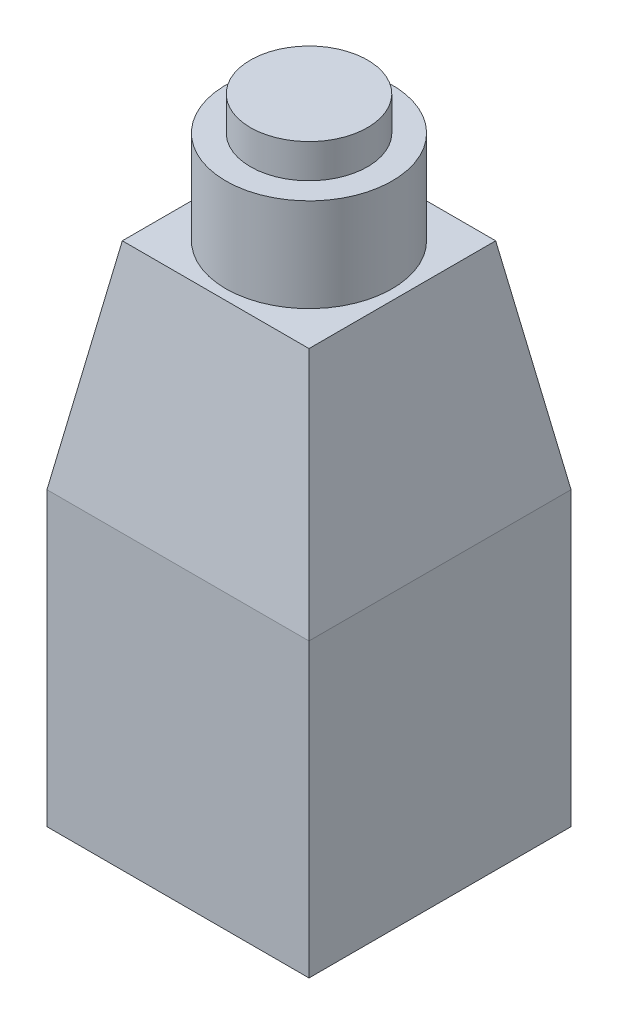
ISO-10303-21;
HEADER;
FILE_DESCRIPTION(('STEP AP214'),'2;1');
FILE_NAME('part.step','',(''),(''),'','','');
FILE_SCHEMA(('AUTOMOTIVE_DESIGN { 1 0 10303 214 1 1 1 1 }'));
ENDSEC;
DATA;
#1=APPLICATION_CONTEXT('core data for automotive mechanical design processes');
#2=APPLICATION_PROTOCOL_DEFINITION('international standard','automotive_design',2000,#1);
#3=PRODUCT_CONTEXT('',#1,'mechanical');
#4=PRODUCT('Part','Part','',(#3));
#5=PRODUCT_RELATED_PRODUCT_CATEGORY('part','',(#4));
#6=PRODUCT_DEFINITION_FORMATION('','',#4);
#7=PRODUCT_DEFINITION_CONTEXT('part definition',#1,'design');
#8=PRODUCT_DEFINITION('design','',#6,#7);
#9=PRODUCT_DEFINITION_SHAPE('','',#8);
#10=(LENGTH_UNIT() NAMED_UNIT(*) SI_UNIT(.MILLI.,.METRE.));
#11=(NAMED_UNIT(*) PLANE_ANGLE_UNIT() SI_UNIT($,.RADIAN.));
#12=(NAMED_UNIT(*) SI_UNIT($,.STERADIAN.) SOLID_ANGLE_UNIT());
#13=UNCERTAINTY_MEASURE_WITH_UNIT(LENGTH_MEASURE(1.E-05),#10,'distance_accuracy_value','');
#14=(GEOMETRIC_REPRESENTATION_CONTEXT(3) GLOBAL_UNCERTAINTY_ASSIGNED_CONTEXT((#13)) GLOBAL_UNIT_ASSIGNED_CONTEXT((#10,
#11,#12)) REPRESENTATION_CONTEXT('',''));
#15=CARTESIAN_POINT('',(0.,0.,0.));
#16=DIRECTION('',(0.,0.,1.));
#17=DIRECTION('',(1.,0.,0.));
#18=AXIS2_PLACEMENT_3D('',#15,#16,#17);
#19=CARTESIAN_POINT('',(-7.72,17.2,-7.72));
#20=DIRECTION('',(1.,0.,0.));
#21=DIRECTION('',(0.,0.,-1.));
#22=AXIS2_PLACEMENT_3D('',#19,#20,#21);
#23=PLANE('',#22);
#24=DIRECTION('',(0.,0.,1.));
#25=VECTOR('',#24,1.);
#26=CARTESIAN_POINT('',(-7.72,0.,-7.72));
#27=LINE('',#26,#25);
#28=CARTESIAN_POINT('',(-7.72,0.,-7.72));
#29=VERTEX_POINT('',#28);
#30=CARTESIAN_POINT('',(-7.72,0.,7.72));
#31=VERTEX_POINT('',#30);
#32=EDGE_CURVE('E200',#29,#31,#27,.T.);
#33=ORIENTED_EDGE('',*,*,#32,.T.);
#34=DIRECTION('',(0.,-1.,0.));
#35=VECTOR('',#34,1.);
#36=CARTESIAN_POINT('',(-7.72,17.2,7.72));
#37=LINE('',#36,#35);
#38=CARTESIAN_POINT('',(-7.72,17.2,7.72));
#39=VERTEX_POINT('',#38);
#40=EDGE_CURVE('E220',#39,#31,#37,.T.);
#41=ORIENTED_EDGE('',*,*,#40,.F.);
#42=DIRECTION('',(0.,0.,1.));
#43=VECTOR('',#42,1.);
#44=CARTESIAN_POINT('',(-7.72,17.2,0.));
#45=LINE('',#44,#43);
#46=CARTESIAN_POINT('',(-7.72,17.2,-7.72));
#47=VERTEX_POINT('',#46);
#48=EDGE_CURVE('E135',#47,#39,#45,.T.);
#49=ORIENTED_EDGE('',*,*,#48,.F.);
#50=DIRECTION('',(0.,-1.,0.));
#51=VECTOR('',#50,1.);
#52=CARTESIAN_POINT('',(-7.72,17.2,-7.72));
#53=LINE('',#52,#51);
#54=EDGE_CURVE('E63',#47,#29,#53,.T.);
#55=ORIENTED_EDGE('',*,*,#54,.T.);
#56=EDGE_LOOP('',(#33,#41,#49,#55));
#57=FACE_BOUND('',#56,.T.);
#58=ADVANCED_FACE('F45',(#57),#23,.F.);
#59=CARTESIAN_POINT('',(-7.72,17.2,7.72));
#60=DIRECTION('',(0.,0.,-1.));
#61=DIRECTION('',(-1.,0.,0.));
#62=AXIS2_PLACEMENT_3D('',#59,#60,#61);
#63=PLANE('',#62);
#64=DIRECTION('',(1.,0.,0.));
#65=VECTOR('',#64,1.);
#66=CARTESIAN_POINT('',(-7.72,0.,7.72));
#67=LINE('',#66,#65);
#68=CARTESIAN_POINT('',(7.72,0.,7.72));
#69=VERTEX_POINT('',#68);
#70=EDGE_CURVE('E204',#31,#69,#67,.T.);
#71=ORIENTED_EDGE('',*,*,#70,.T.);
#72=DIRECTION('',(0.,-1.,0.));
#73=VECTOR('',#72,1.);
#74=CARTESIAN_POINT('',(7.72,17.2,7.72));
#75=LINE('',#74,#73);
#76=CARTESIAN_POINT('',(7.72,17.2,7.72));
#77=VERTEX_POINT('',#76);
#78=EDGE_CURVE('E217',#77,#69,#75,.T.);
#79=ORIENTED_EDGE('',*,*,#78,.F.);
#80=DIRECTION('',(1.,0.,0.));
#81=VECTOR('',#80,1.);
#82=CARTESIAN_POINT('',(0.,17.2,7.72));
#83=LINE('',#82,#81);
#84=EDGE_CURVE('E48',#39,#77,#83,.T.);
#85=ORIENTED_EDGE('',*,*,#84,.F.);
#86=ORIENTED_EDGE('',*,*,#40,.T.);
#87=EDGE_LOOP('',(#71,#79,#85,#86));
#88=FACE_BOUND('',#87,.T.);
#89=ADVANCED_FACE('F233',(#88),#63,.F.);
#90=CARTESIAN_POINT('',(7.72,17.2,-7.72));
#91=DIRECTION('',(-1.,0.,0.));
#92=DIRECTION('',(0.,0.,1.));
#93=AXIS2_PLACEMENT_3D('',#90,#91,#92);
#94=PLANE('',#93);
#95=DIRECTION('',(0.,0.,-1.));
#96=VECTOR('',#95,1.);
#97=CARTESIAN_POINT('',(7.72,0.,-7.72));
#98=LINE('',#97,#96);
#99=CARTESIAN_POINT('',(7.72,0.,-7.72));
#100=VERTEX_POINT('',#99);
#101=EDGE_CURVE('E208',#69,#100,#98,.T.);
#102=ORIENTED_EDGE('',*,*,#101,.T.);
#103=DIRECTION('',(0.,-1.,0.));
#104=VECTOR('',#103,1.);
#105=CARTESIAN_POINT('',(7.72,17.2,-7.72));
#106=LINE('',#105,#104);
#107=CARTESIAN_POINT('',(7.72,17.2,-7.72));
#108=VERTEX_POINT('',#107);
#109=EDGE_CURVE('E221',#108,#100,#106,.T.);
#110=ORIENTED_EDGE('',*,*,#109,.F.);
#111=DIRECTION('',(0.,0.,1.));
#112=VECTOR('',#111,1.);
#113=CARTESIAN_POINT('',(7.72,17.2,0.));
#114=LINE('',#113,#112);
#115=EDGE_CURVE('E226',#77,#108,#114,.F.);
#116=ORIENTED_EDGE('',*,*,#115,.F.);
#117=ORIENTED_EDGE('',*,*,#78,.T.);
#118=EDGE_LOOP('',(#102,#110,#116,#117));
#119=FACE_BOUND('',#118,.T.);
#120=ADVANCED_FACE('F231',(#119),#94,.F.);
#121=CARTESIAN_POINT('',(-7.72,17.2,-7.72));
#122=DIRECTION('',(0.,0.,1.));
#123=DIRECTION('',(1.,0.,0.));
#124=AXIS2_PLACEMENT_3D('',#121,#122,#123);
#125=PLANE('',#124);
#126=DIRECTION('',(-1.,0.,0.));
#127=VECTOR('',#126,1.);
#128=CARTESIAN_POINT('',(-7.72,0.,-7.72));
#129=LINE('',#128,#127);
#130=EDGE_CURVE('E79',#100,#29,#129,.T.);
#131=ORIENTED_EDGE('',*,*,#130,.T.);
#132=ORIENTED_EDGE('',*,*,#54,.F.);
#133=DIRECTION('',(1.,0.,0.));
#134=VECTOR('',#133,1.);
#135=CARTESIAN_POINT('',(0.,17.2,-7.72));
#136=LINE('',#135,#134);
#137=EDGE_CURVE('E224',#108,#47,#136,.F.);
#138=ORIENTED_EDGE('',*,*,#137,.F.);
#139=ORIENTED_EDGE('',*,*,#109,.T.);
#140=EDGE_LOOP('',(#131,#132,#138,#139));
#141=FACE_BOUND('',#140,.T.);
#142=ADVANCED_FACE('F236',(#141),#125,.F.);
#143=CARTESIAN_POINT('',(0.,0.,0.));
#144=DIRECTION('',(0.,1.,0.));
#145=DIRECTION('',(0.,0.,1.));
#146=AXIS2_PLACEMENT_3D('',#143,#144,#145);
#147=PLANE('',#146);
#148=ORIENTED_EDGE('',*,*,#32,.F.);
#149=ORIENTED_EDGE('',*,*,#130,.F.);
#150=ORIENTED_EDGE('',*,*,#101,.F.);
#151=ORIENTED_EDGE('',*,*,#70,.F.);
#152=EDGE_LOOP('',(#148,#149,#150,#151));
#153=FACE_BOUND('',#152,.T.);
#154=ADVANCED_FACE('F235',(#153),#147,.F.);
#155=CARTESIAN_POINT('',(0.,29.9,0.));
#156=DIRECTION('',(0.,1.,0.));
#157=DIRECTION('',(0.,0.,1.));
#158=AXIS2_PLACEMENT_3D('',#155,#156,#157);
#159=PLANE('',#158);
#160=CARTESIAN_POINT('',(0.,29.9,0.));
#161=DIRECTION('',(0.,1.,0.));
#162=DIRECTION('',(0.,0.,1.));
#163=AXIS2_PLACEMENT_3D('',#160,#161,#162);
#164=CIRCLE('',#163,4.9);
#165=CARTESIAN_POINT('',(0.,29.9,4.9));
#166=VERTEX_POINT('',#165);
#167=EDGE_CURVE('E54',#166,#166,#164,.T.);
#168=ORIENTED_EDGE('',*,*,#167,.F.);
#169=EDGE_LOOP('',(#168));
#170=FACE_BOUND('',#169,.T.);
#171=DIRECTION('',(0.,0.,-1.));
#172=VECTOR('',#171,1.);
#173=CARTESIAN_POINT('',(5.5,29.9,-5.5));
#174=LINE('',#173,#172);
#175=CARTESIAN_POINT('',(5.5,29.9,5.5));
#176=VERTEX_POINT('',#175);
#177=CARTESIAN_POINT('',(5.5,29.9,-5.5));
#178=VERTEX_POINT('',#177);
#179=EDGE_CURVE('E129',#176,#178,#174,.T.);
#180=ORIENTED_EDGE('',*,*,#179,.T.);
#181=DIRECTION('',(-1.,0.,0.));
#182=VECTOR('',#181,1.);
#183=CARTESIAN_POINT('',(-5.5,29.9,-5.5));
#184=LINE('',#183,#182);
#185=CARTESIAN_POINT('',(-5.5,29.9,-5.5));
#186=VERTEX_POINT('',#185);
#187=EDGE_CURVE('E111',#178,#186,#184,.T.);
#188=ORIENTED_EDGE('',*,*,#187,.T.);
#189=DIRECTION('',(0.,0.,1.));
#190=VECTOR('',#189,1.);
#191=CARTESIAN_POINT('',(-5.5,29.9,-5.5));
#192=LINE('',#191,#190);
#193=CARTESIAN_POINT('',(-5.5,29.9,5.5));
#194=VERTEX_POINT('',#193);
#195=EDGE_CURVE('E102',#186,#194,#192,.T.);
#196=ORIENTED_EDGE('',*,*,#195,.T.);
#197=DIRECTION('',(1.,0.,0.));
#198=VECTOR('',#197,1.);
#199=CARTESIAN_POINT('',(-5.5,29.9,5.5));
#200=LINE('',#199,#198);
#201=EDGE_CURVE('E107',#194,#176,#200,.T.);
#202=ORIENTED_EDGE('',*,*,#201,.T.);
#203=EDGE_LOOP('',(#180,#188,#196,#202));
#204=FACE_BOUND('',#203,.T.);
#205=ADVANCED_FACE('F106',(#170,#204),#159,.T.);
#206=CARTESIAN_POINT('',(-10.4085684857994,1.8194505542106,0.));
#207=DIRECTION('',(-0.985063375100574,0.172192180529392,0.));
#208=DIRECTION('',(-0.172192180529392,-0.985063375100574,0.));
#209=AXIS2_PLACEMENT_3D('',#206,#207,#208);
#210=PLANE('',#209);
#211=DIRECTION('',(-0.16969481892599,-0.97077666682886,-0.16969481892599));
#212=VECTOR('',#211,1.);
#213=CARTESIAN_POINT('',(-5.5,29.9,-5.5));
#214=LINE('',#213,#212);
#215=EDGE_CURVE('E137',#186,#47,#214,.T.);
#216=ORIENTED_EDGE('',*,*,#215,.T.);
#217=ORIENTED_EDGE('',*,*,#48,.T.);
#218=DIRECTION('',(-0.16969481892599,-0.97077666682886,0.16969481892599));
#219=VECTOR('',#218,1.);
#220=CARTESIAN_POINT('',(-5.5,29.9,5.5));
#221=LINE('',#220,#219);
#222=EDGE_CURVE('E126',#194,#39,#221,.T.);
#223=ORIENTED_EDGE('',*,*,#222,.F.);
#224=ORIENTED_EDGE('',*,*,#195,.F.);
#225=EDGE_LOOP('',(#216,#217,#223,#224));
#226=FACE_BOUND('',#225,.T.);
#227=ADVANCED_FACE('F134',(#226),#210,.T.);
#228=CARTESIAN_POINT('',(0.,1.8194505542106,10.4085684857994));
#229=DIRECTION('',(0.,0.172192180529391,0.985063375100574));
#230=DIRECTION('',(0.,-0.985063375100574,0.172192180529391));
#231=AXIS2_PLACEMENT_3D('',#228,#229,#230);
#232=PLANE('',#231);
#233=ORIENTED_EDGE('',*,*,#222,.T.);
#234=ORIENTED_EDGE('',*,*,#84,.T.);
#235=DIRECTION('',(0.16969481892599,-0.97077666682886,0.16969481892599));
#236=VECTOR('',#235,1.);
#237=CARTESIAN_POINT('',(5.5,29.9,5.5));
#238=LINE('',#237,#236);
#239=EDGE_CURVE('E128',#176,#77,#238,.T.);
#240=ORIENTED_EDGE('',*,*,#239,.F.);
#241=ORIENTED_EDGE('',*,*,#201,.F.);
#242=EDGE_LOOP('',(#233,#234,#240,#241));
#243=FACE_BOUND('',#242,.T.);
#244=ADVANCED_FACE('F125',(#243),#232,.T.);
#245=CARTESIAN_POINT('',(0.,1.81945055421061,-10.4085684857994));
#246=DIRECTION('',(0.,0.172192180529392,-0.985063375100574));
#247=DIRECTION('',(0.,0.985063375100574,0.172192180529392));
#248=AXIS2_PLACEMENT_3D('',#245,#246,#247);
#249=PLANE('',#248);
#250=DIRECTION('',(0.16969481892599,-0.97077666682886,-0.16969481892599));
#251=VECTOR('',#250,1.);
#252=CARTESIAN_POINT('',(5.5,29.9,-5.5));
#253=LINE('',#252,#251);
#254=EDGE_CURVE('E136',#178,#108,#253,.T.);
#255=ORIENTED_EDGE('',*,*,#254,.T.);
#256=ORIENTED_EDGE('',*,*,#137,.T.);
#257=ORIENTED_EDGE('',*,*,#215,.F.);
#258=ORIENTED_EDGE('',*,*,#187,.F.);
#259=EDGE_LOOP('',(#255,#256,#257,#258));
#260=FACE_BOUND('',#259,.T.);
#261=ADVANCED_FACE('F167',(#260),#249,.T.);
#262=CARTESIAN_POINT('',(10.4085684857994,1.8194505542106,0.));
#263=DIRECTION('',(0.985063375100574,0.172192180529391,0.));
#264=DIRECTION('',(-0.172192180529391,0.985063375100574,0.));
#265=AXIS2_PLACEMENT_3D('',#262,#263,#264);
#266=PLANE('',#265);
#267=ORIENTED_EDGE('',*,*,#239,.T.);
#268=ORIENTED_EDGE('',*,*,#115,.T.);
#269=ORIENTED_EDGE('',*,*,#254,.F.);
#270=ORIENTED_EDGE('',*,*,#179,.F.);
#271=EDGE_LOOP('',(#267,#268,#269,#270));
#272=FACE_BOUND('',#271,.T.);
#273=ADVANCED_FACE('F171',(#272),#266,.T.);
#274=CARTESIAN_POINT('',(0.,35.4,0.));
#275=DIRECTION('',(0.,-1.,0.));
#276=DIRECTION('',(0.,0.,-1.));
#277=AXIS2_PLACEMENT_3D('',#274,#275,#276);
#278=CYLINDRICAL_SURFACE('',#277,4.9);
#279=CARTESIAN_POINT('',(0.,35.4,0.));
#280=DIRECTION('',(0.,1.,0.));
#281=DIRECTION('',(0.,0.,1.));
#282=AXIS2_PLACEMENT_3D('',#279,#280,#281);
#283=CIRCLE('',#282,4.9);
#284=CARTESIAN_POINT('',(0.,35.4,4.9));
#285=VERTEX_POINT('',#284);
#286=EDGE_CURVE('E265',#285,#285,#283,.T.);
#287=ORIENTED_EDGE('',*,*,#286,.F.);
#288=EDGE_LOOP('',(#287));
#289=FACE_BOUND('',#288,.T.);
#290=ORIENTED_EDGE('',*,*,#167,.T.);
#291=EDGE_LOOP('',(#290));
#292=FACE_BOUND('',#291,.T.);
#293=ADVANCED_FACE('F238',(#289,#292),#278,.T.);
#294=CARTESIAN_POINT('',(0.,35.4,0.));
#295=DIRECTION('',(0.,1.,0.));
#296=DIRECTION('',(0.,0.,1.));
#297=AXIS2_PLACEMENT_3D('',#294,#295,#296);
#298=PLANE('',#297);
#299=CARTESIAN_POINT('',(0.,35.4,0.));
#300=DIRECTION('',(0.,1.,0.));
#301=DIRECTION('',(0.,0.,1.));
#302=AXIS2_PLACEMENT_3D('',#299,#300,#301);
#303=CIRCLE('',#302,3.45);
#304=CARTESIAN_POINT('',(0.,35.4,3.45));
#305=VERTEX_POINT('',#304);
#306=EDGE_CURVE('E12',#305,#305,#303,.T.);
#307=ORIENTED_EDGE('',*,*,#306,.F.);
#308=EDGE_LOOP('',(#307));
#309=FACE_BOUND('',#308,.T.);
#310=ORIENTED_EDGE('',*,*,#286,.T.);
#311=EDGE_LOOP('',(#310));
#312=FACE_BOUND('',#311,.T.);
#313=ADVANCED_FACE('F242',(#309,#312),#298,.T.);
#314=CARTESIAN_POINT('',(0.,37.4,0.));
#315=DIRECTION('',(0.,-1.,0.));
#316=DIRECTION('',(0.,0.,-1.));
#317=AXIS2_PLACEMENT_3D('',#314,#315,#316);
#318=CYLINDRICAL_SURFACE('',#317,3.45);
#319=CARTESIAN_POINT('',(0.,37.4,0.));
#320=DIRECTION('',(0.,1.,0.));
#321=DIRECTION('',(0.,0.,1.));
#322=AXIS2_PLACEMENT_3D('',#319,#320,#321);
#323=CIRCLE('',#322,3.45);
#324=CARTESIAN_POINT('',(0.,37.4,3.45));
#325=VERTEX_POINT('',#324);
#326=EDGE_CURVE('E267',#325,#325,#323,.T.);
#327=ORIENTED_EDGE('',*,*,#326,.F.);
#328=EDGE_LOOP('',(#327));
#329=FACE_BOUND('',#328,.T.);
#330=ORIENTED_EDGE('',*,*,#306,.T.);
#331=EDGE_LOOP('',(#330));
#332=FACE_BOUND('',#331,.T.);
#333=ADVANCED_FACE('F274',(#329,#332),#318,.T.);
#334=CARTESIAN_POINT('',(0.,37.4,0.));
#335=DIRECTION('',(0.,1.,0.));
#336=DIRECTION('',(0.,0.,1.));
#337=AXIS2_PLACEMENT_3D('',#334,#335,#336);
#338=PLANE('',#337);
#339=ORIENTED_EDGE('',*,*,#326,.T.);
#340=EDGE_LOOP('',(#339));
#341=FACE_BOUND('',#340,.T.);
#342=ADVANCED_FACE('F272',(#341),#338,.T.);
#343=CLOSED_SHELL('',(#58,#89,#120,#142,#154,#205,#227,#244,#261,#273,#293,#313,#333,#342));
#344=MANIFOLD_SOLID_BREP('B2',#343);
#345=ADVANCED_BREP_SHAPE_REPRESENTATION('',(#18,#344),#14);
#346=SHAPE_DEFINITION_REPRESENTATION(#9,#345);
ENDSEC;
END-ISO-10303-21;
